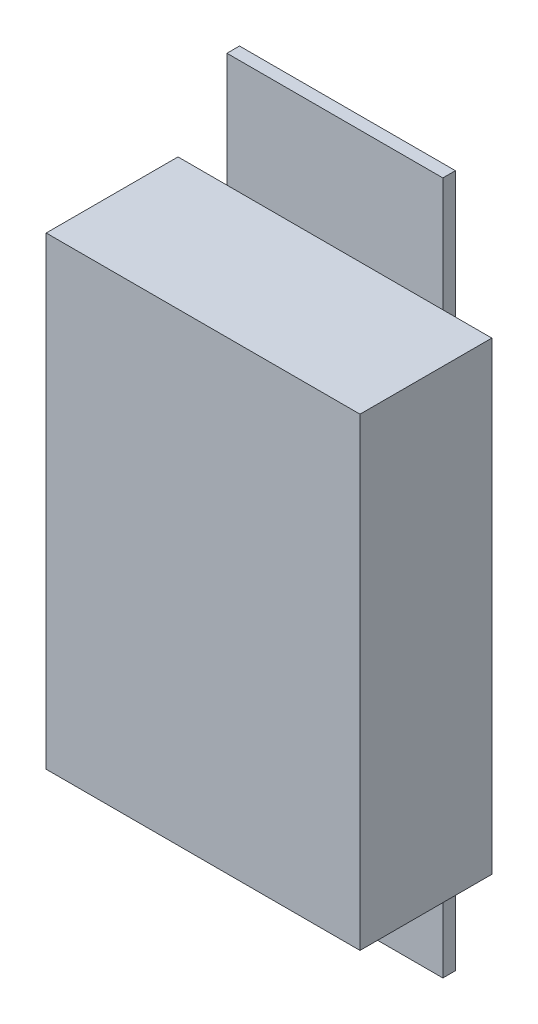
ISO-10303-21;
HEADER;
FILE_DESCRIPTION(('STEP AP214'),'2;1');
FILE_NAME('part.step','',(''),(''),'','','');
FILE_SCHEMA(('AUTOMOTIVE_DESIGN { 1 0 10303 214 1 1 1 1 }'));
ENDSEC;
DATA;
#1=APPLICATION_CONTEXT('core data for automotive mechanical design processes');
#2=APPLICATION_PROTOCOL_DEFINITION('international standard','automotive_design',2000,#1);
#3=PRODUCT_CONTEXT('',#1,'mechanical');
#4=PRODUCT('Part','Part','',(#3));
#5=PRODUCT_RELATED_PRODUCT_CATEGORY('part','',(#4));
#6=PRODUCT_DEFINITION_FORMATION('','',#4);
#7=PRODUCT_DEFINITION_CONTEXT('part definition',#1,'design');
#8=PRODUCT_DEFINITION('design','',#6,#7);
#9=PRODUCT_DEFINITION_SHAPE('','',#8);
#10=(LENGTH_UNIT() NAMED_UNIT(*) SI_UNIT(.MILLI.,.METRE.));
#11=(NAMED_UNIT(*) PLANE_ANGLE_UNIT() SI_UNIT($,.RADIAN.));
#12=(NAMED_UNIT(*) SI_UNIT($,.STERADIAN.) SOLID_ANGLE_UNIT());
#13=UNCERTAINTY_MEASURE_WITH_UNIT(LENGTH_MEASURE(1.E-05),#10,'distance_accuracy_value','');
#14=(GEOMETRIC_REPRESENTATION_CONTEXT(3) GLOBAL_UNCERTAINTY_ASSIGNED_CONTEXT((#13)) GLOBAL_UNIT_ASSIGNED_CONTEXT((#10,
#11,#12)) REPRESENTATION_CONTEXT('',''));
#15=CARTESIAN_POINT('',(0.,0.,0.));
#16=DIRECTION('',(0.,0.,1.));
#17=DIRECTION('',(1.,0.,0.));
#18=AXIS2_PLACEMENT_3D('',#15,#16,#17);
#19=CARTESIAN_POINT('',(0.,0.,1.15));
#20=DIRECTION('',(0.,0.,1.));
#21=DIRECTION('',(0.,-1.,0.));
#22=AXIS2_PLACEMENT_3D('',#19,#20,#21);
#23=PLANE('',#22);
#24=DIRECTION('',(1.,0.,0.));
#25=VECTOR('',#24,1.);
#26=CARTESIAN_POINT('',(-1.25,-1.85,1.15));
#27=LINE('',#26,#25);
#28=CARTESIAN_POINT('',(-1.25,-1.85,1.15));
#29=VERTEX_POINT('',#28);
#30=CARTESIAN_POINT('',(1.25,-1.85,1.15));
#31=VERTEX_POINT('',#30);
#32=EDGE_CURVE('P0_E98',#29,#31,#27,.T.);
#33=ORIENTED_EDGE('',*,*,#32,.T.);
#34=DIRECTION('',(0.,1.,0.));
#35=VECTOR('',#34,1.);
#36=CARTESIAN_POINT('',(1.25,-1.85,1.15));
#37=LINE('',#36,#35);
#38=CARTESIAN_POINT('',(1.25,1.85,1.15));
#39=VERTEX_POINT('',#38);
#40=EDGE_CURVE('P0_E77',#31,#39,#37,.T.);
#41=ORIENTED_EDGE('',*,*,#40,.T.);
#42=DIRECTION('',(-1.,0.,0.));
#43=VECTOR('',#42,1.);
#44=CARTESIAN_POINT('',(1.25,1.85,1.15));
#45=LINE('',#44,#43);
#46=CARTESIAN_POINT('',(-1.25,1.85,1.15));
#47=VERTEX_POINT('',#46);
#48=EDGE_CURVE('P0_E82',#39,#47,#45,.T.);
#49=ORIENTED_EDGE('',*,*,#48,.T.);
#50=DIRECTION('',(0.,-1.,0.));
#51=VECTOR('',#50,1.);
#52=CARTESIAN_POINT('',(-1.25,1.85,1.15));
#53=LINE('',#52,#51);
#54=EDGE_CURVE('P0_E11',#47,#29,#53,.T.);
#55=ORIENTED_EDGE('',*,*,#54,.T.);
#56=EDGE_LOOP('',(#33,#41,#49,#55));
#57=FACE_BOUND('',#56,.T.);
#58=ADVANCED_FACE('P0_F17',(#57),#23,.T.);
#59=CARTESIAN_POINT('',(0.,0.,0.1));
#60=DIRECTION('',(0.,0.,1.));
#61=DIRECTION('',(0.,-1.,0.));
#62=AXIS2_PLACEMENT_3D('',#59,#60,#61);
#63=PLANE('',#62);
#64=DIRECTION('',(0.,-1.,0.));
#65=VECTOR('',#64,1.);
#66=CARTESIAN_POINT('',(-1.25,1.85,0.1));
#67=LINE('',#66,#65);
#68=CARTESIAN_POINT('',(-1.25,1.85,0.1));
#69=VERTEX_POINT('',#68);
#70=CARTESIAN_POINT('',(-1.25,-1.85,0.1));
#71=VERTEX_POINT('',#70);
#72=EDGE_CURVE('P0_E25',#69,#71,#67,.T.);
#73=ORIENTED_EDGE('',*,*,#72,.F.);
#74=DIRECTION('',(-1.,0.,0.));
#75=VECTOR('',#74,1.);
#76=CARTESIAN_POINT('',(1.25,1.85,0.1));
#77=LINE('',#76,#75);
#78=CARTESIAN_POINT('',(1.25,1.85,0.1));
#79=VERTEX_POINT('',#78);
#80=EDGE_CURVE('P0_E67',#79,#69,#77,.T.);
#81=ORIENTED_EDGE('',*,*,#80,.F.);
#82=DIRECTION('',(0.,1.,0.));
#83=VECTOR('',#82,1.);
#84=CARTESIAN_POINT('',(1.25,-1.85,0.1));
#85=LINE('',#84,#83);
#86=CARTESIAN_POINT('',(1.25,-1.85,0.1));
#87=VERTEX_POINT('',#86);
#88=EDGE_CURVE('P0_E71',#87,#79,#85,.T.);
#89=ORIENTED_EDGE('',*,*,#88,.F.);
#90=DIRECTION('',(1.,0.,0.));
#91=VECTOR('',#90,1.);
#92=CARTESIAN_POINT('',(-1.25,-1.85,0.1));
#93=LINE('',#92,#91);
#94=EDGE_CURVE('P0_E118',#71,#87,#93,.T.);
#95=ORIENTED_EDGE('',*,*,#94,.F.);
#96=EDGE_LOOP('',(#73,#81,#89,#95));
#97=FACE_BOUND('',#96,.T.);
#98=ADVANCED_FACE('P0_F69',(#97),#63,.F.);
#99=CARTESIAN_POINT('',(-1.25,1.85,0.1));
#100=DIRECTION('',(1.,0.,0.));
#101=DIRECTION('',(0.,1.,0.));
#102=AXIS2_PLACEMENT_3D('',#99,#100,#101);
#103=PLANE('',#102);
#104=ORIENTED_EDGE('',*,*,#72,.T.);
#105=DIRECTION('',(0.,0.,1.));
#106=VECTOR('',#105,1.);
#107=CARTESIAN_POINT('',(-1.25,-1.85,0.1));
#108=LINE('',#107,#106);
#109=EDGE_CURVE('P0_E92',#71,#29,#108,.T.);
#110=ORIENTED_EDGE('',*,*,#109,.T.);
#111=ORIENTED_EDGE('',*,*,#54,.F.);
#112=DIRECTION('',(0.,0.,1.));
#113=VECTOR('',#112,1.);
#114=CARTESIAN_POINT('',(-1.25,1.85,0.1));
#115=LINE('',#114,#113);
#116=EDGE_CURVE('P0_E76',#69,#47,#115,.T.);
#117=ORIENTED_EDGE('',*,*,#116,.F.);
#118=EDGE_LOOP('',(#104,#110,#111,#117));
#119=FACE_BOUND('',#118,.T.);
#120=ADVANCED_FACE('P0_F114',(#119),#103,.F.);
#121=CARTESIAN_POINT('',(1.25,1.85,0.1));
#122=DIRECTION('',(0.,-1.,0.));
#123=DIRECTION('',(0.,0.,-1.));
#124=AXIS2_PLACEMENT_3D('',#121,#122,#123);
#125=PLANE('',#124);
#126=ORIENTED_EDGE('',*,*,#80,.T.);
#127=ORIENTED_EDGE('',*,*,#116,.T.);
#128=ORIENTED_EDGE('',*,*,#48,.F.);
#129=DIRECTION('',(0.,0.,1.));
#130=VECTOR('',#129,1.);
#131=CARTESIAN_POINT('',(1.25,1.85,0.1));
#132=LINE('',#131,#130);
#133=EDGE_CURVE('P0_E80',#79,#39,#132,.T.);
#134=ORIENTED_EDGE('',*,*,#133,.F.);
#135=EDGE_LOOP('',(#126,#127,#128,#134));
#136=FACE_BOUND('',#135,.T.);
#137=ADVANCED_FACE('P0_F81',(#136),#125,.F.);
#138=CARTESIAN_POINT('',(1.25,-1.85,0.1));
#139=DIRECTION('',(-1.,0.,0.));
#140=DIRECTION('',(0.,0.,1.));
#141=AXIS2_PLACEMENT_3D('',#138,#139,#140);
#142=PLANE('',#141);
#143=ORIENTED_EDGE('',*,*,#88,.T.);
#144=ORIENTED_EDGE('',*,*,#133,.T.);
#145=ORIENTED_EDGE('',*,*,#40,.F.);
#146=DIRECTION('',(0.,0.,1.));
#147=VECTOR('',#146,1.);
#148=CARTESIAN_POINT('',(1.25,-1.85,0.1));
#149=LINE('',#148,#147);
#150=EDGE_CURVE('P0_E89',#87,#31,#149,.T.);
#151=ORIENTED_EDGE('',*,*,#150,.F.);
#152=EDGE_LOOP('',(#143,#144,#145,#151));
#153=FACE_BOUND('',#152,.T.);
#154=ADVANCED_FACE('P0_F87',(#153),#142,.F.);
#155=CARTESIAN_POINT('',(-1.25,-1.85,0.1));
#156=DIRECTION('',(0.,1.,0.));
#157=DIRECTION('',(1.,0.,0.));
#158=AXIS2_PLACEMENT_3D('',#155,#156,#157);
#159=PLANE('',#158);
#160=ORIENTED_EDGE('',*,*,#94,.T.);
#161=ORIENTED_EDGE('',*,*,#150,.T.);
#162=ORIENTED_EDGE('',*,*,#32,.F.);
#163=ORIENTED_EDGE('',*,*,#109,.F.);
#164=EDGE_LOOP('',(#160,#161,#162,#163));
#165=FACE_BOUND('',#164,.T.);
#166=ADVANCED_FACE('P0_F117',(#165),#159,.F.);
#167=CLOSED_SHELL('',(#58,#98,#120,#137,#154,#166));
#168=MANIFOLD_SOLID_BREP('P0_B1',#167);
#169=CARTESIAN_POINT('',(-0.86,1.64,0.1));
#170=DIRECTION('',(0.,0.,1.));
#171=DIRECTION('',(1.,0.,0.));
#172=AXIS2_PLACEMENT_3D('',#169,#170,#171);
#173=PLANE('',#172);
#174=DIRECTION('',(0.,1.,0.));
#175=VECTOR('',#174,1.);
#176=CARTESIAN_POINT('',(-0.86,1.64,0.1));
#177=LINE('',#176,#175);
#178=CARTESIAN_POINT('',(-0.86,1.64,0.1));
#179=VERTEX_POINT('',#178);
#180=CARTESIAN_POINT('',(-0.86,2.76,0.1));
#181=VERTEX_POINT('',#180);
#182=EDGE_CURVE('P1_E77',#179,#181,#177,.T.);
#183=ORIENTED_EDGE('',*,*,#182,.F.);
#184=DIRECTION('',(1.,0.,0.));
#185=VECTOR('',#184,1.);
#186=CARTESIAN_POINT('',(-0.86,1.64,0.1));
#187=LINE('',#186,#185);
#188=CARTESIAN_POINT('',(0.86,1.64,0.1));
#189=VERTEX_POINT('',#188);
#190=EDGE_CURVE('P1_E72',#179,#189,#187,.T.);
#191=ORIENTED_EDGE('',*,*,#190,.T.);
#192=DIRECTION('',(0.,1.,0.));
#193=VECTOR('',#192,1.);
#194=CARTESIAN_POINT('',(0.86,1.64,0.1));
#195=LINE('',#194,#193);
#196=CARTESIAN_POINT('',(0.86,2.76,0.1));
#197=VERTEX_POINT('',#196);
#198=EDGE_CURVE('P1_E74',#189,#197,#195,.T.);
#199=ORIENTED_EDGE('',*,*,#198,.T.);
#200=DIRECTION('',(1.,0.,0.));
#201=VECTOR('',#200,1.);
#202=CARTESIAN_POINT('',(-0.86,2.76,0.1));
#203=LINE('',#202,#201);
#204=EDGE_CURVE('P1_E11',#181,#197,#203,.T.);
#205=ORIENTED_EDGE('',*,*,#204,.F.);
#206=EDGE_LOOP('',(#183,#191,#199,#205));
#207=FACE_BOUND('',#206,.T.);
#208=ADVANCED_FACE('P1_F17',(#207),#173,.T.);
#209=CARTESIAN_POINT('',(-0.86,1.64,0.));
#210=DIRECTION('',(0.,0.,1.));
#211=DIRECTION('',(1.,0.,0.));
#212=AXIS2_PLACEMENT_3D('',#209,#210,#211);
#213=PLANE('',#212);
#214=DIRECTION('',(1.,0.,0.));
#215=VECTOR('',#214,1.);
#216=CARTESIAN_POINT('',(-0.86,2.76,0.));
#217=LINE('',#216,#215);
#218=CARTESIAN_POINT('',(-0.86,2.76,0.));
#219=VERTEX_POINT('',#218);
#220=CARTESIAN_POINT('',(0.86,2.76,0.));
#221=VERTEX_POINT('',#220);
#222=EDGE_CURVE('P1_E27',#219,#221,#217,.T.);
#223=ORIENTED_EDGE('',*,*,#222,.T.);
#224=DIRECTION('',(0.,1.,0.));
#225=VECTOR('',#224,1.);
#226=CARTESIAN_POINT('',(0.86,1.64,0.));
#227=LINE('',#226,#225);
#228=CARTESIAN_POINT('',(0.86,1.64,0.));
#229=VERTEX_POINT('',#228);
#230=EDGE_CURVE('P1_E92',#229,#221,#227,.T.);
#231=ORIENTED_EDGE('',*,*,#230,.F.);
#232=DIRECTION('',(1.,0.,0.));
#233=VECTOR('',#232,1.);
#234=CARTESIAN_POINT('',(-0.86,1.64,0.));
#235=LINE('',#234,#233);
#236=CARTESIAN_POINT('',(-0.86,1.64,0.));
#237=VERTEX_POINT('',#236);
#238=EDGE_CURVE('P1_E20',#237,#229,#235,.T.);
#239=ORIENTED_EDGE('',*,*,#238,.F.);
#240=DIRECTION('',(0.,1.,0.));
#241=VECTOR('',#240,1.);
#242=CARTESIAN_POINT('',(-0.86,1.64,0.));
#243=LINE('',#242,#241);
#244=EDGE_CURVE('P1_E99',#237,#219,#243,.T.);
#245=ORIENTED_EDGE('',*,*,#244,.T.);
#246=EDGE_LOOP('',(#223,#231,#239,#245));
#247=FACE_BOUND('',#246,.T.);
#248=ADVANCED_FACE('P1_F111',(#247),#213,.F.);
#249=CARTESIAN_POINT('',(-0.86,2.76,0.));
#250=DIRECTION('',(0.,1.,0.));
#251=DIRECTION('',(1.,0.,0.));
#252=AXIS2_PLACEMENT_3D('',#249,#250,#251);
#253=PLANE('',#252);
#254=ORIENTED_EDGE('',*,*,#222,.F.);
#255=DIRECTION('',(0.,0.,1.));
#256=VECTOR('',#255,1.);
#257=CARTESIAN_POINT('',(-0.86,2.76,0.));
#258=LINE('',#257,#256);
#259=EDGE_CURVE('P1_E169',#219,#181,#258,.T.);
#260=ORIENTED_EDGE('',*,*,#259,.T.);
#261=ORIENTED_EDGE('',*,*,#204,.T.);
#262=DIRECTION('',(0.,0.,1.));
#263=VECTOR('',#262,1.);
#264=CARTESIAN_POINT('',(0.86,2.76,0.));
#265=LINE('',#264,#263);
#266=EDGE_CURVE('P1_E87',#221,#197,#265,.T.);
#267=ORIENTED_EDGE('',*,*,#266,.F.);
#268=EDGE_LOOP('',(#254,#260,#261,#267));
#269=FACE_BOUND('',#268,.T.);
#270=ADVANCED_FACE('P1_F116',(#269),#253,.T.);
#271=CARTESIAN_POINT('',(-0.86,1.64,0.));
#272=DIRECTION('',(0.,1.,0.));
#273=DIRECTION('',(1.,0.,0.));
#274=AXIS2_PLACEMENT_3D('',#271,#272,#273);
#275=PLANE('',#274);
#276=DIRECTION('',(0.,0.,1.));
#277=VECTOR('',#276,1.);
#278=CARTESIAN_POINT('',(0.86,1.64,0.));
#279=LINE('',#278,#277);
#280=EDGE_CURVE('P1_E86',#229,#189,#279,.T.);
#281=ORIENTED_EDGE('',*,*,#280,.T.);
#282=ORIENTED_EDGE('',*,*,#190,.F.);
#283=DIRECTION('',(0.,0.,1.));
#284=VECTOR('',#283,1.);
#285=CARTESIAN_POINT('',(-0.86,1.64,0.));
#286=LINE('',#285,#284);
#287=EDGE_CURVE('P1_E93',#237,#179,#286,.T.);
#288=ORIENTED_EDGE('',*,*,#287,.F.);
#289=ORIENTED_EDGE('',*,*,#238,.T.);
#290=EDGE_LOOP('',(#281,#282,#288,#289));
#291=FACE_BOUND('',#290,.T.);
#292=ADVANCED_FACE('P1_F90',(#291),#275,.F.);
#293=CARTESIAN_POINT('',(0.86,1.64,0.));
#294=DIRECTION('',(1.,0.,0.));
#295=DIRECTION('',(0.,1.,0.));
#296=AXIS2_PLACEMENT_3D('',#293,#294,#295);
#297=PLANE('',#296);
#298=ORIENTED_EDGE('',*,*,#280,.F.);
#299=ORIENTED_EDGE('',*,*,#230,.T.);
#300=ORIENTED_EDGE('',*,*,#266,.T.);
#301=ORIENTED_EDGE('',*,*,#198,.F.);
#302=EDGE_LOOP('',(#298,#299,#300,#301));
#303=FACE_BOUND('',#302,.T.);
#304=ADVANCED_FACE('P1_F84',(#303),#297,.T.);
#305=CARTESIAN_POINT('',(-0.86,1.64,0.));
#306=DIRECTION('',(1.,0.,0.));
#307=DIRECTION('',(0.,1.,0.));
#308=AXIS2_PLACEMENT_3D('',#305,#306,#307);
#309=PLANE('',#308);
#310=ORIENTED_EDGE('',*,*,#182,.T.);
#311=ORIENTED_EDGE('',*,*,#259,.F.);
#312=ORIENTED_EDGE('',*,*,#244,.F.);
#313=ORIENTED_EDGE('',*,*,#287,.T.);
#314=EDGE_LOOP('',(#310,#311,#312,#313));
#315=FACE_BOUND('',#314,.T.);
#316=ADVANCED_FACE('P1_F121',(#315),#309,.F.);
#317=CLOSED_SHELL('',(#208,#248,#270,#292,#304,#316));
#318=MANIFOLD_SOLID_BREP('P1_B1',#317);
#319=CARTESIAN_POINT('',(-0.86,-2.76,0.1));
#320=DIRECTION('',(0.,0.,1.));
#321=DIRECTION('',(1.,0.,0.));
#322=AXIS2_PLACEMENT_3D('',#319,#320,#321);
#323=PLANE('',#322);
#324=DIRECTION('',(0.,1.,0.));
#325=VECTOR('',#324,1.);
#326=CARTESIAN_POINT('',(-0.86,-2.76,0.1));
#327=LINE('',#326,#325);
#328=CARTESIAN_POINT('',(-0.86,-2.76,0.1));
#329=VERTEX_POINT('',#328);
#330=CARTESIAN_POINT('',(-0.86,-1.64,0.1));
#331=VERTEX_POINT('',#330);
#332=EDGE_CURVE('P2_E88',#329,#331,#327,.T.);
#333=ORIENTED_EDGE('',*,*,#332,.F.);
#334=DIRECTION('',(1.,0.,0.));
#335=VECTOR('',#334,1.);
#336=CARTESIAN_POINT('',(-0.86,-2.76,0.1));
#337=LINE('',#336,#335);
#338=CARTESIAN_POINT('',(0.86,-2.76,0.1));
#339=VERTEX_POINT('',#338);
#340=EDGE_CURVE('P2_E70',#329,#339,#337,.T.);
#341=ORIENTED_EDGE('',*,*,#340,.T.);
#342=DIRECTION('',(0.,1.,0.));
#343=VECTOR('',#342,1.);
#344=CARTESIAN_POINT('',(0.86,-2.76,0.1));
#345=LINE('',#344,#343);
#346=CARTESIAN_POINT('',(0.86,-1.64,0.1));
#347=VERTEX_POINT('',#346);
#348=EDGE_CURVE('P2_E82',#339,#347,#345,.T.);
#349=ORIENTED_EDGE('',*,*,#348,.T.);
#350=DIRECTION('',(1.,0.,0.));
#351=VECTOR('',#350,1.);
#352=CARTESIAN_POINT('',(-0.86,-1.64,0.1));
#353=LINE('',#352,#351);
#354=EDGE_CURVE('P2_E11',#331,#347,#353,.T.);
#355=ORIENTED_EDGE('',*,*,#354,.F.);
#356=EDGE_LOOP('',(#333,#341,#349,#355));
#357=FACE_BOUND('',#356,.T.);
#358=ADVANCED_FACE('P2_F17',(#357),#323,.T.);
#359=CARTESIAN_POINT('',(-0.86,-2.76,0.));
#360=DIRECTION('',(0.,0.,1.));
#361=DIRECTION('',(1.,0.,0.));
#362=AXIS2_PLACEMENT_3D('',#359,#360,#361);
#363=PLANE('',#362);
#364=DIRECTION('',(1.,0.,0.));
#365=VECTOR('',#364,1.);
#366=CARTESIAN_POINT('',(-0.86,-1.64,0.));
#367=LINE('',#366,#365);
#368=CARTESIAN_POINT('',(-0.86,-1.64,0.));
#369=VERTEX_POINT('',#368);
#370=CARTESIAN_POINT('',(0.86,-1.64,0.));
#371=VERTEX_POINT('',#370);
#372=EDGE_CURVE('P2_E25',#369,#371,#367,.T.);
#373=ORIENTED_EDGE('',*,*,#372,.T.);
#374=DIRECTION('',(0.,1.,0.));
#375=VECTOR('',#374,1.);
#376=CARTESIAN_POINT('',(0.86,-2.76,0.));
#377=LINE('',#376,#375);
#378=CARTESIAN_POINT('',(0.86,-2.76,0.));
#379=VERTEX_POINT('',#378);
#380=EDGE_CURVE('P2_E107',#379,#371,#377,.T.);
#381=ORIENTED_EDGE('',*,*,#380,.F.);
#382=DIRECTION('',(1.,0.,0.));
#383=VECTOR('',#382,1.);
#384=CARTESIAN_POINT('',(-0.86,-2.76,0.));
#385=LINE('',#384,#383);
#386=CARTESIAN_POINT('',(-0.86,-2.76,0.));
#387=VERTEX_POINT('',#386);
#388=EDGE_CURVE('P2_E81',#387,#379,#385,.T.);
#389=ORIENTED_EDGE('',*,*,#388,.F.);
#390=DIRECTION('',(0.,1.,0.));
#391=VECTOR('',#390,1.);
#392=CARTESIAN_POINT('',(-0.86,-2.76,0.));
#393=LINE('',#392,#391);
#394=EDGE_CURVE('P2_E89',#387,#369,#393,.T.);
#395=ORIENTED_EDGE('',*,*,#394,.T.);
#396=EDGE_LOOP('',(#373,#381,#389,#395));
#397=FACE_BOUND('',#396,.T.);
#398=ADVANCED_FACE('P2_F119',(#397),#363,.F.);
#399=CARTESIAN_POINT('',(-0.86,-1.64,0.));
#400=DIRECTION('',(0.,1.,0.));
#401=DIRECTION('',(1.,0.,0.));
#402=AXIS2_PLACEMENT_3D('',#399,#400,#401);
#403=PLANE('',#402);
#404=ORIENTED_EDGE('',*,*,#372,.F.);
#405=DIRECTION('',(0.,0.,1.));
#406=VECTOR('',#405,1.);
#407=CARTESIAN_POINT('',(-0.86,-1.64,0.));
#408=LINE('',#407,#406);
#409=EDGE_CURVE('P2_E93',#369,#331,#408,.T.);
#410=ORIENTED_EDGE('',*,*,#409,.T.);
#411=ORIENTED_EDGE('',*,*,#354,.T.);
#412=DIRECTION('',(0.,0.,1.));
#413=VECTOR('',#412,1.);
#414=CARTESIAN_POINT('',(0.86,-1.64,0.));
#415=LINE('',#414,#413);
#416=EDGE_CURVE('P2_E108',#371,#347,#415,.T.);
#417=ORIENTED_EDGE('',*,*,#416,.F.);
#418=EDGE_LOOP('',(#404,#410,#411,#417));
#419=FACE_BOUND('',#418,.T.);
#420=ADVANCED_FACE('P2_F118',(#419),#403,.T.);
#421=CARTESIAN_POINT('',(-0.86,-2.76,0.));
#422=DIRECTION('',(0.,1.,0.));
#423=DIRECTION('',(1.,0.,0.));
#424=AXIS2_PLACEMENT_3D('',#421,#422,#423);
#425=PLANE('',#424);
#426=DIRECTION('',(0.,0.,1.));
#427=VECTOR('',#426,1.);
#428=CARTESIAN_POINT('',(0.86,-2.76,0.));
#429=LINE('',#428,#427);
#430=EDGE_CURVE('P2_E76',#379,#339,#429,.T.);
#431=ORIENTED_EDGE('',*,*,#430,.T.);
#432=ORIENTED_EDGE('',*,*,#340,.F.);
#433=DIRECTION('',(0.,0.,1.));
#434=VECTOR('',#433,1.);
#435=CARTESIAN_POINT('',(-0.86,-2.76,0.));
#436=LINE('',#435,#434);
#437=EDGE_CURVE('P2_E73',#387,#329,#436,.T.);
#438=ORIENTED_EDGE('',*,*,#437,.F.);
#439=ORIENTED_EDGE('',*,*,#388,.T.);
#440=EDGE_LOOP('',(#431,#432,#438,#439));
#441=FACE_BOUND('',#440,.T.);
#442=ADVANCED_FACE('P2_F72',(#441),#425,.F.);
#443=CARTESIAN_POINT('',(0.86,-2.76,0.));
#444=DIRECTION('',(1.,0.,0.));
#445=DIRECTION('',(0.,1.,0.));
#446=AXIS2_PLACEMENT_3D('',#443,#444,#445);
#447=PLANE('',#446);
#448=ORIENTED_EDGE('',*,*,#430,.F.);
#449=ORIENTED_EDGE('',*,*,#380,.T.);
#450=ORIENTED_EDGE('',*,*,#416,.T.);
#451=ORIENTED_EDGE('',*,*,#348,.F.);
#452=EDGE_LOOP('',(#448,#449,#450,#451));
#453=FACE_BOUND('',#452,.T.);
#454=ADVANCED_FACE('P2_F117',(#453),#447,.T.);
#455=CARTESIAN_POINT('',(-0.86,-2.76,0.));
#456=DIRECTION('',(1.,0.,0.));
#457=DIRECTION('',(0.,1.,0.));
#458=AXIS2_PLACEMENT_3D('',#455,#456,#457);
#459=PLANE('',#458);
#460=ORIENTED_EDGE('',*,*,#332,.T.);
#461=ORIENTED_EDGE('',*,*,#409,.F.);
#462=ORIENTED_EDGE('',*,*,#394,.F.);
#463=ORIENTED_EDGE('',*,*,#437,.T.);
#464=EDGE_LOOP('',(#460,#461,#462,#463));
#465=FACE_BOUND('',#464,.T.);
#466=ADVANCED_FACE('P2_F86',(#465),#459,.F.);
#467=CLOSED_SHELL('',(#358,#398,#420,#442,#454,#466));
#468=MANIFOLD_SOLID_BREP('P2_B1',#467);
#469=ADVANCED_BREP_SHAPE_REPRESENTATION('',(#18,#168,#318,#468),#14);
#470=SHAPE_DEFINITION_REPRESENTATION(#9,#469);
ENDSEC;
END-ISO-10303-21;
